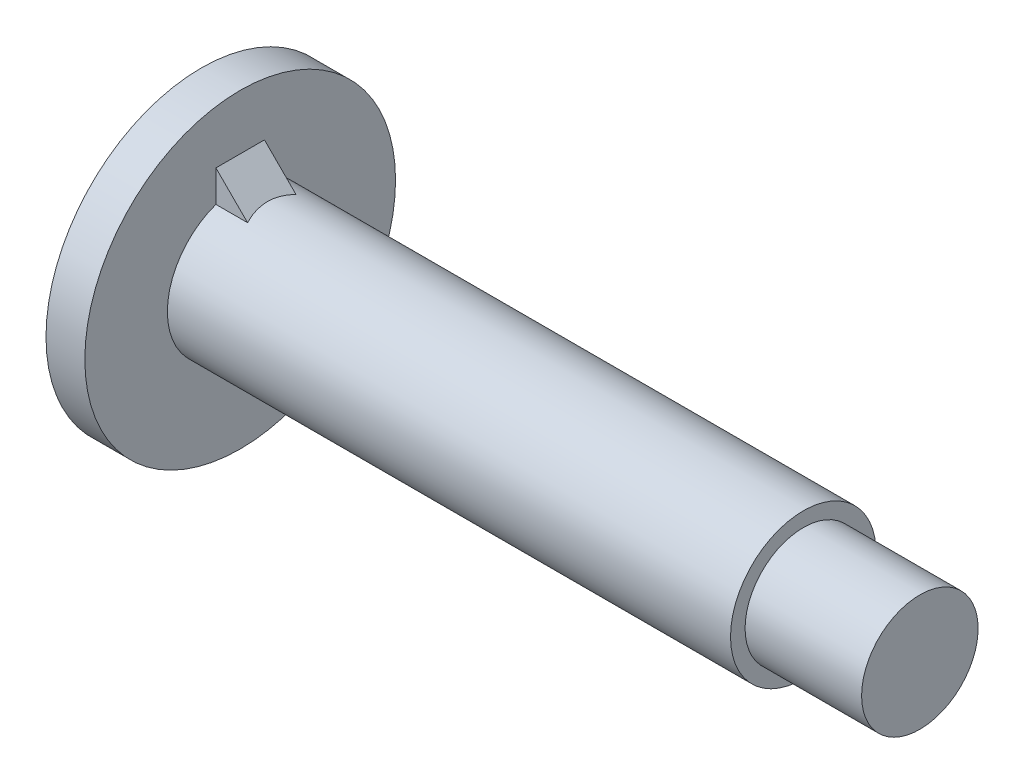
ISO-10303-21;
HEADER;
FILE_DESCRIPTION(('STEP AP214'),'2;1');
FILE_NAME('part.step','',(''),(''),'','','');
FILE_SCHEMA(('AUTOMOTIVE_DESIGN { 1 0 10303 214 1 1 1 1 }'));
ENDSEC;
DATA;
#1=APPLICATION_CONTEXT('core data for automotive mechanical design processes');
#2=APPLICATION_PROTOCOL_DEFINITION('international standard','automotive_design',2000,#1);
#3=PRODUCT_CONTEXT('',#1,'mechanical');
#4=PRODUCT('Part','Part','',(#3));
#5=PRODUCT_RELATED_PRODUCT_CATEGORY('part','',(#4));
#6=PRODUCT_DEFINITION_FORMATION('','',#4);
#7=PRODUCT_DEFINITION_CONTEXT('part definition',#1,'design');
#8=PRODUCT_DEFINITION('design','',#6,#7);
#9=PRODUCT_DEFINITION_SHAPE('','',#8);
#10=(LENGTH_UNIT() NAMED_UNIT(*) SI_UNIT(.MILLI.,.METRE.));
#11=(NAMED_UNIT(*) PLANE_ANGLE_UNIT() SI_UNIT($,.RADIAN.));
#12=(NAMED_UNIT(*) SI_UNIT($,.STERADIAN.) SOLID_ANGLE_UNIT());
#13=UNCERTAINTY_MEASURE_WITH_UNIT(LENGTH_MEASURE(1.E-05),#10,'distance_accuracy_value','');
#14=(GEOMETRIC_REPRESENTATION_CONTEXT(3) GLOBAL_UNCERTAINTY_ASSIGNED_CONTEXT((#13)) GLOBAL_UNIT_ASSIGNED_CONTEXT((#10,
#11,#12)) REPRESENTATION_CONTEXT('',''));
#15=CARTESIAN_POINT('',(0.,0.,0.));
#16=DIRECTION('',(0.,0.,1.));
#17=DIRECTION('',(1.,0.,0.));
#18=AXIS2_PLACEMENT_3D('',#15,#16,#17);
#19=CARTESIAN_POINT('',(0.,0.,0.));
#20=DIRECTION('',(-1.,0.,0.));
#21=DIRECTION('',(0.,0.,1.));
#22=AXIS2_PLACEMENT_3D('',#19,#20,#21);
#23=CYLINDRICAL_SURFACE('',#22,3.75);
#24=CARTESIAN_POINT('',(31.,0.,0.));
#25=DIRECTION('',(-1.,0.,0.));
#26=DIRECTION('',(0.,0.,1.));
#27=AXIS2_PLACEMENT_3D('',#24,#25,#26);
#28=CIRCLE('',#27,3.75);
#29=CARTESIAN_POINT('',(31.,0.,3.75));
#30=VERTEX_POINT('',#29);
#31=EDGE_CURVE('E94',#30,#30,#28,.T.);
#32=ORIENTED_EDGE('',*,*,#31,.T.);
#33=EDGE_LOOP('',(#32));
#34=FACE_BOUND('',#33,.T.);
#35=DIRECTION('',(-1.,0.,0.));
#36=VECTOR('',#35,1.);
#37=CARTESIAN_POINT('',(0.,3.53553390593273,1.25));
#38=LINE('',#37,#36);
#39=CARTESIAN_POINT('',(2.,3.53553390593273,1.25));
#40=VERTEX_POINT('',#39);
#41=CARTESIAN_POINT('',(3.62867965644044,3.53553390593273,1.25));
#42=VERTEX_POINT('',#41);
#43=EDGE_CURVE('E76',#40,#42,#38,.F.);
#44=ORIENTED_EDGE('',*,*,#43,.F.);
#45=CARTESIAN_POINT('',(2.,0.,0.));
#46=DIRECTION('',(-1.,0.,0.));
#47=DIRECTION('',(0.,0.,1.));
#48=AXIS2_PLACEMENT_3D('',#45,#46,#47);
#49=CIRCLE('',#48,3.74999999999999);
#50=CARTESIAN_POINT('',(2.,3.53553390593273,-1.25));
#51=VERTEX_POINT('',#50);
#52=EDGE_CURVE('E83',#51,#40,#49,.T.);
#53=ORIENTED_EDGE('',*,*,#52,.F.);
#54=DIRECTION('',(-1.,0.,0.));
#55=VECTOR('',#54,1.);
#56=CARTESIAN_POINT('',(0.,3.53553390593273,-1.25));
#57=LINE('',#56,#55);
#58=CARTESIAN_POINT('',(3.62867965644037,3.53553390593273,-1.25));
#59=VERTEX_POINT('',#58);
#60=EDGE_CURVE('E48',#51,#59,#57,.F.);
#61=ORIENTED_EDGE('',*,*,#60,.T.);
#62=CARTESIAN_POINT('',(7.16421356237314,0.,0.));
#63=DIRECTION('',(-0.707106781186544,-0.707106781186551,0.));
#64=DIRECTION('',(-0.707106781186551,0.707106781186544,0.));
#65=AXIS2_PLACEMENT_3D('',#62,#63,#64);
#66=ELLIPSE('',#65,5.30330085889913,3.75);
#67=EDGE_CURVE('E69',#42,#59,#66,.T.);
#68=ORIENTED_EDGE('',*,*,#67,.F.);
#69=EDGE_LOOP('',(#44,#53,#61,#68));
#70=FACE_BOUND('',#69,.T.);
#71=ADVANCED_FACE('F33',(#34,#70),#23,.T.);
#72=CARTESIAN_POINT('',(2.,3.74999999999999,0.));
#73=DIRECTION('',(-1.,0.,0.));
#74=DIRECTION('',(0.,0.,1.));
#75=AXIS2_PLACEMENT_3D('',#72,#73,#74);
#76=PLANE('',#75);
#77=CARTESIAN_POINT('',(2.,0.,0.));
#78=DIRECTION('',(-1.,0.,0.));
#79=DIRECTION('',(0.,0.,1.));
#80=AXIS2_PLACEMENT_3D('',#77,#78,#79);
#81=CIRCLE('',#80,8.);
#82=CARTESIAN_POINT('',(2.,0.,8.));
#83=VERTEX_POINT('',#82);
#84=EDGE_CURVE('E90',#83,#83,#81,.T.);
#85=ORIENTED_EDGE('',*,*,#84,.F.);
#86=EDGE_LOOP('',(#85));
#87=FACE_BOUND('',#86,.T.);
#88=DIRECTION('',(0.,-1.,0.));
#89=VECTOR('',#88,1.);
#90=CARTESIAN_POINT('',(2.,3.74999999999999,1.25));
#91=LINE('',#90,#89);
#92=CARTESIAN_POINT('',(2.,5.16421356237308,1.25));
#93=VERTEX_POINT('',#92);
#94=EDGE_CURVE('E11',#93,#40,#91,.T.);
#95=ORIENTED_EDGE('',*,*,#94,.F.);
#96=DIRECTION('',(0.,0.,1.));
#97=VECTOR('',#96,1.);
#98=CARTESIAN_POINT('',(2.,5.16421356237308,0.));
#99=LINE('',#98,#97);
#100=CARTESIAN_POINT('',(2.,5.16421356237308,-1.25));
#101=VERTEX_POINT('',#100);
#102=EDGE_CURVE('E41',#101,#93,#99,.T.);
#103=ORIENTED_EDGE('',*,*,#102,.F.);
#104=DIRECTION('',(0.,-1.,0.));
#105=VECTOR('',#104,1.);
#106=CARTESIAN_POINT('',(2.,3.74999999999999,-1.25));
#107=LINE('',#106,#105);
#108=EDGE_CURVE('E79',#101,#51,#107,.T.);
#109=ORIENTED_EDGE('',*,*,#108,.T.);
#110=ORIENTED_EDGE('',*,*,#52,.T.);
#111=EDGE_LOOP('',(#95,#103,#109,#110));
#112=FACE_BOUND('',#111,.T.);
#113=ADVANCED_FACE('F105',(#87,#112),#76,.F.);
#114=CARTESIAN_POINT('',(0.,8.,0.));
#115=DIRECTION('',(1.,0.,0.));
#116=DIRECTION('',(0.,0.,-1.));
#117=AXIS2_PLACEMENT_3D('',#114,#115,#116);
#118=PLANE('',#117);
#119=CARTESIAN_POINT('',(0.,0.,0.));
#120=DIRECTION('',(-1.,0.,0.));
#121=DIRECTION('',(0.,0.,1.));
#122=AXIS2_PLACEMENT_3D('',#119,#120,#121);
#123=CIRCLE('',#122,8.);
#124=CARTESIAN_POINT('',(0.,0.,8.));
#125=VERTEX_POINT('',#124);
#126=EDGE_CURVE('E75',#125,#125,#123,.T.);
#127=ORIENTED_EDGE('',*,*,#126,.T.);
#128=EDGE_LOOP('',(#127));
#129=FACE_BOUND('',#128,.T.);
#130=ADVANCED_FACE('F35',(#129),#118,.F.);
#131=CARTESIAN_POINT('',(37.,0.,0.));
#132=DIRECTION('',(-1.,0.,0.));
#133=DIRECTION('',(0.,0.,1.));
#134=AXIS2_PLACEMENT_3D('',#131,#132,#133);
#135=PLANE('',#134);
#136=CARTESIAN_POINT('',(37.,0.,0.));
#137=DIRECTION('',(-1.,0.,0.));
#138=DIRECTION('',(0.,0.,1.));
#139=AXIS2_PLACEMENT_3D('',#136,#137,#138);
#140=CIRCLE('',#139,3.);
#141=CARTESIAN_POINT('',(37.,0.,3.));
#142=VERTEX_POINT('',#141);
#143=EDGE_CURVE('E100',#142,#142,#140,.T.);
#144=ORIENTED_EDGE('',*,*,#143,.F.);
#145=EDGE_LOOP('',(#144));
#146=FACE_BOUND('',#145,.T.);
#147=ADVANCED_FACE('F113',(#146),#135,.F.);
#148=CARTESIAN_POINT('',(0.,0.,0.));
#149=DIRECTION('',(-1.,0.,0.));
#150=DIRECTION('',(0.,0.,1.));
#151=AXIS2_PLACEMENT_3D('',#148,#149,#150);
#152=CYLINDRICAL_SURFACE('',#151,3.);
#153=CARTESIAN_POINT('',(31.,0.,0.));
#154=DIRECTION('',(-1.,0.,0.));
#155=DIRECTION('',(0.,0.,1.));
#156=AXIS2_PLACEMENT_3D('',#153,#154,#155);
#157=CIRCLE('',#156,3.);
#158=CARTESIAN_POINT('',(31.,0.,3.));
#159=VERTEX_POINT('',#158);
#160=EDGE_CURVE('E97',#159,#159,#157,.T.);
#161=ORIENTED_EDGE('',*,*,#160,.F.);
#162=EDGE_LOOP('',(#161));
#163=FACE_BOUND('',#162,.T.);
#164=ORIENTED_EDGE('',*,*,#143,.T.);
#165=EDGE_LOOP('',(#164));
#166=FACE_BOUND('',#165,.T.);
#167=ADVANCED_FACE('F125',(#163,#166),#152,.T.);
#168=CARTESIAN_POINT('',(31.,3.,0.));
#169=DIRECTION('',(-1.,0.,0.));
#170=DIRECTION('',(0.,0.,1.));
#171=AXIS2_PLACEMENT_3D('',#168,#169,#170);
#172=PLANE('',#171);
#173=ORIENTED_EDGE('',*,*,#31,.F.);
#174=EDGE_LOOP('',(#173));
#175=FACE_BOUND('',#174,.T.);
#176=ORIENTED_EDGE('',*,*,#160,.T.);
#177=EDGE_LOOP('',(#176));
#178=FACE_BOUND('',#177,.T.);
#179=ADVANCED_FACE('F122',(#175,#178),#172,.F.);
#180=CARTESIAN_POINT('',(0.,0.,0.));
#181=DIRECTION('',(-1.,0.,0.));
#182=DIRECTION('',(0.,0.,1.));
#183=AXIS2_PLACEMENT_3D('',#180,#181,#182);
#184=CYLINDRICAL_SURFACE('',#183,8.);
#185=ORIENTED_EDGE('',*,*,#126,.F.);
#186=EDGE_LOOP('',(#185));
#187=FACE_BOUND('',#186,.T.);
#188=ORIENTED_EDGE('',*,*,#84,.T.);
#189=EDGE_LOOP('',(#188));
#190=FACE_BOUND('',#189,.T.);
#191=ADVANCED_FACE('F119',(#187,#190),#184,.T.);
#192=CARTESIAN_POINT('',(2.,5.16421356237308,1.25));
#193=DIRECTION('',(-0.707106781186544,-0.707106781186551,0.));
#194=DIRECTION('',(0.707106781186551,-0.707106781186544,0.));
#195=AXIS2_PLACEMENT_3D('',#192,#193,#194);
#196=PLANE('',#195);
#197=DIRECTION('',(-0.707106781186567,0.707106781186528,0.));
#198=VECTOR('',#197,1.);
#199=CARTESIAN_POINT('',(2.,5.16421356237308,1.25));
#200=LINE('',#199,#198);
#201=EDGE_CURVE('E73',#42,#93,#200,.T.);
#202=ORIENTED_EDGE('',*,*,#201,.F.);
#203=ORIENTED_EDGE('',*,*,#67,.T.);
#204=DIRECTION('',(-0.707106781186551,0.707106781186544,0.));
#205=VECTOR('',#204,1.);
#206=CARTESIAN_POINT('',(2.,5.16421356237308,-1.25));
#207=LINE('',#206,#205);
#208=EDGE_CURVE('E71',#59,#101,#207,.T.);
#209=ORIENTED_EDGE('',*,*,#208,.T.);
#210=ORIENTED_EDGE('',*,*,#102,.T.);
#211=EDGE_LOOP('',(#202,#203,#209,#210));
#212=FACE_BOUND('',#211,.T.);
#213=ADVANCED_FACE('F70',(#212),#196,.F.);
#214=CARTESIAN_POINT('',(0.,0.,1.25));
#215=DIRECTION('',(0.,0.,-1.));
#216=DIRECTION('',(-1.,0.,0.));
#217=AXIS2_PLACEMENT_3D('',#214,#215,#216);
#218=PLANE('',#217);
#219=ORIENTED_EDGE('',*,*,#94,.T.);
#220=ORIENTED_EDGE('',*,*,#43,.T.);
#221=ORIENTED_EDGE('',*,*,#201,.T.);
#222=EDGE_LOOP('',(#219,#220,#221));
#223=FACE_BOUND('',#222,.T.);
#224=ADVANCED_FACE('F104',(#223),#218,.F.);
#225=CARTESIAN_POINT('',(0.,0.,-1.25));
#226=DIRECTION('',(0.,0.,-1.));
#227=DIRECTION('',(-1.,0.,0.));
#228=AXIS2_PLACEMENT_3D('',#225,#226,#227);
#229=PLANE('',#228);
#230=ORIENTED_EDGE('',*,*,#60,.F.);
#231=ORIENTED_EDGE('',*,*,#108,.F.);
#232=ORIENTED_EDGE('',*,*,#208,.F.);
#233=EDGE_LOOP('',(#230,#231,#232));
#234=FACE_BOUND('',#233,.T.);
#235=ADVANCED_FACE('F78',(#234),#229,.T.);
#236=CLOSED_SHELL('',(#71,#113,#130,#147,#167,#179,#191,#213,#224,#235));
#237=MANIFOLD_SOLID_BREP('B2',#236);
#238=ADVANCED_BREP_SHAPE_REPRESENTATION('',(#18,#237),#14);
#239=SHAPE_DEFINITION_REPRESENTATION(#9,#238);
ENDSEC;
END-ISO-10303-21;
